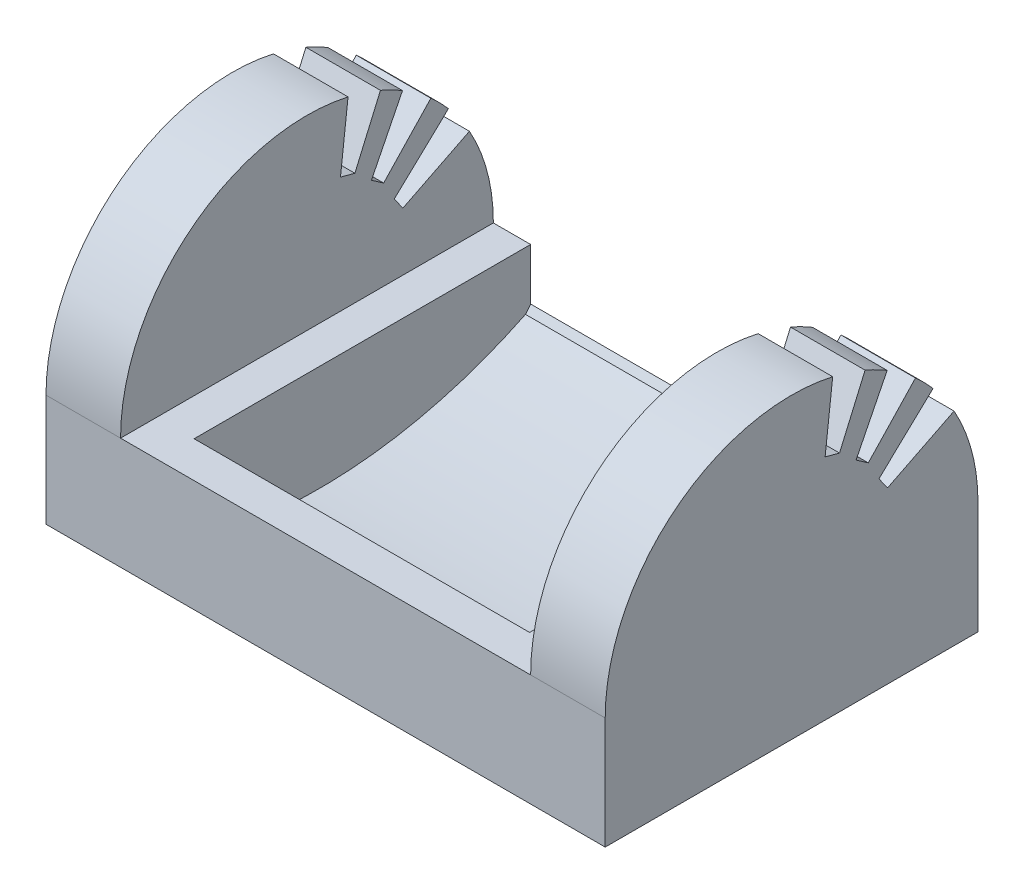
ISO-10303-21;
HEADER;
FILE_DESCRIPTION(('STEP AP214'),'2;1');
FILE_NAME('part.step','',(''),(''),'','','');
FILE_SCHEMA(('AUTOMOTIVE_DESIGN { 1 0 10303 214 1 1 1 1 }'));
ENDSEC;
DATA;
#1=APPLICATION_CONTEXT('core data for automotive mechanical design processes');
#2=APPLICATION_PROTOCOL_DEFINITION('international standard','automotive_design',2000,#1);
#3=PRODUCT_CONTEXT('',#1,'mechanical');
#4=PRODUCT('Part','Part','',(#3));
#5=PRODUCT_RELATED_PRODUCT_CATEGORY('part','',(#4));
#6=PRODUCT_DEFINITION_FORMATION('','',#4);
#7=PRODUCT_DEFINITION_CONTEXT('part definition',#1,'design');
#8=PRODUCT_DEFINITION('design','',#6,#7);
#9=PRODUCT_DEFINITION_SHAPE('','',#8);
#10=(LENGTH_UNIT() NAMED_UNIT(*) SI_UNIT(.MILLI.,.METRE.));
#11=(NAMED_UNIT(*) PLANE_ANGLE_UNIT() SI_UNIT($,.RADIAN.));
#12=(NAMED_UNIT(*) SI_UNIT($,.STERADIAN.) SOLID_ANGLE_UNIT());
#13=UNCERTAINTY_MEASURE_WITH_UNIT(LENGTH_MEASURE(1.E-05),#10,'distance_accuracy_value','');
#14=(GEOMETRIC_REPRESENTATION_CONTEXT(3) GLOBAL_UNCERTAINTY_ASSIGNED_CONTEXT((#13)) GLOBAL_UNIT_ASSIGNED_CONTEXT((#10,
#11,#12)) REPRESENTATION_CONTEXT('',''));
#15=CARTESIAN_POINT('',(0.,0.,0.));
#16=DIRECTION('',(0.,0.,1.));
#17=DIRECTION('',(1.,0.,0.));
#18=AXIS2_PLACEMENT_3D('',#15,#16,#17);
#19=CARTESIAN_POINT('',(0.,30.,0.));
#20=DIRECTION('',(0.,-1.,0.));
#21=DIRECTION('',(0.,0.,-1.));
#22=AXIS2_PLACEMENT_3D('',#19,#20,#21);
#23=PLANE('',#22);
#24=DIRECTION('',(0.,0.,1.));
#25=VECTOR('',#24,1.);
#26=CARTESIAN_POINT('',(30.,30.0000000000003,-111.193302220869));
#27=LINE('',#26,#25);
#28=CARTESIAN_POINT('',(30.,30.0000000000003,-100.));
#29=VERTEX_POINT('',#28);
#30=CARTESIAN_POINT('',(30.,30.0000000000003,-9.73338768577279));
#31=VERTEX_POINT('',#30);
#32=EDGE_CURVE('E259',#29,#31,#27,.T.);
#33=ORIENTED_EDGE('',*,*,#32,.F.);
#34=DIRECTION('',(-1.,0.,0.));
#35=VECTOR('',#34,1.);
#36=CARTESIAN_POINT('',(0.,30.,-100.));
#37=LINE('',#36,#35);
#38=CARTESIAN_POINT('',(20.,30.,-100.));
#39=VERTEX_POINT('',#38);
#40=EDGE_CURVE('E461',#29,#39,#37,.T.);
#41=ORIENTED_EDGE('',*,*,#40,.T.);
#42=DIRECTION('',(0.,0.,1.));
#43=VECTOR('',#42,1.);
#44=CARTESIAN_POINT('',(20.,29.9999999999996,0.));
#45=LINE('',#44,#43);
#46=CARTESIAN_POINT('',(20.,30.,0.));
#47=VERTEX_POINT('',#46);
#48=EDGE_CURVE('E425',#39,#47,#45,.T.);
#49=ORIENTED_EDGE('',*,*,#48,.T.);
#50=DIRECTION('',(1.,0.,0.));
#51=VECTOR('',#50,1.);
#52=CARTESIAN_POINT('',(0.,30.,0.));
#53=LINE('',#52,#51);
#54=CARTESIAN_POINT('',(130.,29.9999999999996,0.));
#55=VERTEX_POINT('',#54);
#56=EDGE_CURVE('E462',#47,#55,#53,.T.);
#57=ORIENTED_EDGE('',*,*,#56,.T.);
#58=DIRECTION('',(0.,0.,-1.));
#59=VECTOR('',#58,1.);
#60=CARTESIAN_POINT('',(130.,29.9999999999996,0.));
#61=LINE('',#60,#59);
#62=CARTESIAN_POINT('',(130.,30.,-100.));
#63=VERTEX_POINT('',#62);
#64=EDGE_CURVE('E442',#55,#63,#61,.T.);
#65=ORIENTED_EDGE('',*,*,#64,.T.);
#66=CARTESIAN_POINT('',(120.,30.,-100.));
#67=VERTEX_POINT('',#66);
#68=EDGE_CURVE('E467',#63,#67,#37,.T.);
#69=ORIENTED_EDGE('',*,*,#68,.T.);
#70=DIRECTION('',(0.,0.,1.));
#71=VECTOR('',#70,1.);
#72=CARTESIAN_POINT('',(120.,30.,-111.193302220869));
#73=LINE('',#72,#71);
#74=CARTESIAN_POINT('',(120.,30.,-9.73338768577281));
#75=VERTEX_POINT('',#74);
#76=EDGE_CURVE('E47',#67,#75,#73,.T.);
#77=ORIENTED_EDGE('',*,*,#76,.T.);
#78=DIRECTION('',(1.,0.,0.));
#79=VECTOR('',#78,1.);
#80=CARTESIAN_POINT('',(30.,30.0000000000003,-9.73338768577279));
#81=LINE('',#80,#79);
#82=EDGE_CURVE('E275',#31,#75,#81,.T.);
#83=ORIENTED_EDGE('',*,*,#82,.F.);
#84=EDGE_LOOP('',(#33,#41,#49,#57,#65,#69,#77,#83));
#85=FACE_BOUND('',#84,.T.);
#86=ADVANCED_FACE('F32',(#85),#23,.F.);
#87=CARTESIAN_POINT('',(0.,30.,-100.));
#88=DIRECTION('',(0.,0.,1.));
#89=DIRECTION('',(1.,0.,0.));
#90=AXIS2_PLACEMENT_3D('',#87,#88,#89);
#91=PLANE('',#90);
#92=DIRECTION('',(0.,1.,0.));
#93=VECTOR('',#92,1.);
#94=CARTESIAN_POINT('',(30.,30.,-100.));
#95=LINE('',#94,#93);
#96=CARTESIAN_POINT('',(30.,16.1624074250111,-100.));
#97=VERTEX_POINT('',#96);
#98=EDGE_CURVE('E11',#97,#29,#95,.T.);
#99=ORIENTED_EDGE('',*,*,#98,.F.);
#100=DIRECTION('',(1.,0.,0.));
#101=VECTOR('',#100,1.);
#102=CARTESIAN_POINT('',(0.,16.1624074250113,-100.));
#103=LINE('',#102,#101);
#104=CARTESIAN_POINT('',(120.,16.1624074250108,-100.));
#105=VERTEX_POINT('',#104);
#106=EDGE_CURVE('E40',#97,#105,#103,.T.);
#107=ORIENTED_EDGE('',*,*,#106,.T.);
#108=DIRECTION('',(0.,1.,0.));
#109=VECTOR('',#108,1.);
#110=CARTESIAN_POINT('',(120.,30.,-100.));
#111=LINE('',#110,#109);
#112=EDGE_CURVE('E514',#105,#67,#111,.T.);
#113=ORIENTED_EDGE('',*,*,#112,.T.);
#114=ORIENTED_EDGE('',*,*,#68,.F.);
#115=CARTESIAN_POINT('',(150.,30.,-100.));
#116=VERTEX_POINT('',#115);
#117=EDGE_CURVE('E463',#116,#63,#37,.T.);
#118=ORIENTED_EDGE('',*,*,#117,.F.);
#119=DIRECTION('',(0.,-1.,0.));
#120=VECTOR('',#119,1.);
#121=CARTESIAN_POINT('',(150.,30.,-100.));
#122=LINE('',#121,#120);
#123=CARTESIAN_POINT('',(150.,0.,-100.));
#124=VERTEX_POINT('',#123);
#125=EDGE_CURVE('E478',#116,#124,#122,.T.);
#126=ORIENTED_EDGE('',*,*,#125,.T.);
#127=DIRECTION('',(-1.,0.,0.));
#128=VECTOR('',#127,1.);
#129=CARTESIAN_POINT('',(0.,0.,-100.));
#130=LINE('',#129,#128);
#131=CARTESIAN_POINT('',(0.,0.,-100.));
#132=VERTEX_POINT('',#131);
#133=EDGE_CURVE('E474',#124,#132,#130,.T.);
#134=ORIENTED_EDGE('',*,*,#133,.T.);
#135=DIRECTION('',(0.,-1.,0.));
#136=VECTOR('',#135,1.);
#137=CARTESIAN_POINT('',(0.,30.,-100.));
#138=LINE('',#137,#136);
#139=CARTESIAN_POINT('',(0.,30.,-100.));
#140=VERTEX_POINT('',#139);
#141=EDGE_CURVE('E466',#140,#132,#138,.T.);
#142=ORIENTED_EDGE('',*,*,#141,.F.);
#143=DIRECTION('',(-1.,0.,0.));
#144=VECTOR('',#143,1.);
#145=CARTESIAN_POINT('',(0.,30.,-100.));
#146=LINE('',#145,#144);
#147=EDGE_CURVE('E422',#39,#140,#146,.T.);
#148=ORIENTED_EDGE('',*,*,#147,.F.);
#149=ORIENTED_EDGE('',*,*,#40,.F.);
#150=EDGE_LOOP('',(#99,#107,#113,#114,#118,#126,#134,#142,#148,#149));
#151=FACE_BOUND('',#150,.T.);
#152=ADVANCED_FACE('F517',(#151),#91,.F.);
#153=CARTESIAN_POINT('',(150.,30.,-50.));
#154=DIRECTION('',(-1.,0.,0.));
#155=DIRECTION('',(0.,0.,1.));
#156=AXIS2_PLACEMENT_3D('',#153,#154,#155);
#157=CYLINDRICAL_SURFACE('',#156,50.);
#158=CARTESIAN_POINT('',(130.,30.,-50.));
#159=DIRECTION('',(-1.,0.,0.));
#160=DIRECTION('',(0.,0.,1.));
#161=AXIS2_PLACEMENT_3D('',#158,#159,#160);
#162=CIRCLE('',#161,50.);
#163=CARTESIAN_POINT('',(130.,75.9503803838504,-69.711989817861));
#164=VERTEX_POINT('',#163);
#165=CARTESIAN_POINT('',(130.,72.9304289105035,-75.6315874178757));
#166=VERTEX_POINT('',#165);
#167=EDGE_CURVE('E450',#164,#166,#162,.T.);
#168=ORIENTED_EDGE('',*,*,#167,.F.);
#169=DIRECTION('',(-1.,0.,0.));
#170=VECTOR('',#169,1.);
#171=CARTESIAN_POINT('',(150.,75.9503803838504,-69.711989817861));
#172=LINE('',#171,#170);
#173=CARTESIAN_POINT('',(150.,75.9503803838504,-69.711989817861));
#174=VERTEX_POINT('',#173);
#175=EDGE_CURVE('E367',#164,#174,#172,.F.);
#176=ORIENTED_EDGE('',*,*,#175,.T.);
#177=CARTESIAN_POINT('',(150.,30.,-50.));
#178=DIRECTION('',(-1.,0.,0.));
#179=DIRECTION('',(0.,0.,1.));
#180=AXIS2_PLACEMENT_3D('',#177,#178,#179);
#181=CIRCLE('',#180,50.);
#182=CARTESIAN_POINT('',(150.,72.9304289105035,-75.6315874178757));
#183=VERTEX_POINT('',#182);
#184=EDGE_CURVE('E456',#174,#183,#181,.T.);
#185=ORIENTED_EDGE('',*,*,#184,.T.);
#186=DIRECTION('',(-1.,0.,0.));
#187=VECTOR('',#186,1.);
#188=CARTESIAN_POINT('',(150.,72.9304289105035,-75.6315874178757));
#189=LINE('',#188,#187);
#190=EDGE_CURVE('E340',#183,#166,#189,.T.);
#191=ORIENTED_EDGE('',*,*,#190,.T.);
#192=EDGE_LOOP('',(#168,#176,#185,#191));
#193=FACE_BOUND('',#192,.T.);
#194=ADVANCED_FACE('F550',(#193),#157,.T.);
#195=CARTESIAN_POINT('',(130.,67.358313012282,-83.2318589440368));
#196=VERTEX_POINT('',#195);
#197=CARTESIAN_POINT('',(130.,62.5716220085484,-87.9353323398153));
#198=VERTEX_POINT('',#197);
#199=EDGE_CURVE('E451',#196,#198,#162,.T.);
#200=ORIENTED_EDGE('',*,*,#199,.F.);
#201=DIRECTION('',(-1.,0.,0.));
#202=VECTOR('',#201,1.);
#203=CARTESIAN_POINT('',(150.,67.358313012282,-83.2318589440368));
#204=LINE('',#203,#202);
#205=CARTESIAN_POINT('',(150.,67.358313012282,-83.2318589440368));
#206=VERTEX_POINT('',#205);
#207=EDGE_CURVE('E349',#196,#206,#204,.F.);
#208=ORIENTED_EDGE('',*,*,#207,.T.);
#209=CARTESIAN_POINT('',(150.,62.5716220085485,-87.9353323398153));
#210=VERTEX_POINT('',#209);
#211=EDGE_CURVE('E457',#206,#210,#181,.T.);
#212=ORIENTED_EDGE('',*,*,#211,.T.);
#213=DIRECTION('',(-1.,0.,0.));
#214=VECTOR('',#213,1.);
#215=CARTESIAN_POINT('',(150.,62.5716220085485,-87.9353323398153));
#216=LINE('',#215,#214);
#217=EDGE_CURVE('E407',#210,#198,#216,.T.);
#218=ORIENTED_EDGE('',*,*,#217,.T.);
#219=EDGE_LOOP('',(#200,#208,#212,#218));
#220=FACE_BOUND('',#219,.T.);
#221=ADVANCED_FACE('F651',(#220),#157,.T.);
#222=CARTESIAN_POINT('',(150.,30.,-50.));
#223=DIRECTION('',(-1.,0.,0.));
#224=DIRECTION('',(0.,0.,1.));
#225=AXIS2_PLACEMENT_3D('',#222,#223,#224);
#226=CYLINDRICAL_SURFACE('',#225,50.);
#227=CARTESIAN_POINT('',(0.,30.,-50.));
#228=DIRECTION('',(-1.,0.,0.));
#229=DIRECTION('',(0.,0.,1.));
#230=AXIS2_PLACEMENT_3D('',#227,#228,#229);
#231=CIRCLE('',#230,50.);
#232=CARTESIAN_POINT('',(0.,75.9503803838504,-69.711989817861));
#233=VERTEX_POINT('',#232);
#234=CARTESIAN_POINT('',(0.,72.9304289105035,-75.6315874178757));
#235=VERTEX_POINT('',#234);
#236=EDGE_CURVE('E432',#233,#235,#231,.T.);
#237=ORIENTED_EDGE('',*,*,#236,.F.);
#238=DIRECTION('',(-1.,0.,0.));
#239=VECTOR('',#238,1.);
#240=CARTESIAN_POINT('',(150.,75.9503803838504,-69.711989817861));
#241=LINE('',#240,#239);
#242=CARTESIAN_POINT('',(20.,75.9503803838504,-69.711989817861));
#243=VERTEX_POINT('',#242);
#244=EDGE_CURVE('E505',#233,#243,#241,.F.);
#245=ORIENTED_EDGE('',*,*,#244,.T.);
#246=CARTESIAN_POINT('',(20.,30.,-50.));
#247=DIRECTION('',(-1.,0.,0.));
#248=DIRECTION('',(0.,0.,1.));
#249=AXIS2_PLACEMENT_3D('',#246,#247,#248);
#250=CIRCLE('',#249,50.);
#251=CARTESIAN_POINT('',(20.,72.9304289105035,-75.6315874178757));
#252=VERTEX_POINT('',#251);
#253=EDGE_CURVE('E438',#243,#252,#250,.T.);
#254=ORIENTED_EDGE('',*,*,#253,.T.);
#255=DIRECTION('',(-1.,0.,0.));
#256=VECTOR('',#255,1.);
#257=CARTESIAN_POINT('',(150.,72.9304289105035,-75.6315874178757));
#258=LINE('',#257,#256);
#259=EDGE_CURVE('E496',#252,#235,#258,.T.);
#260=ORIENTED_EDGE('',*,*,#259,.T.);
#261=EDGE_LOOP('',(#237,#245,#254,#260));
#262=FACE_BOUND('',#261,.T.);
#263=ADVANCED_FACE('F590',(#262),#226,.T.);
#264=CARTESIAN_POINT('',(0.,67.358313012282,-83.2318589440368));
#265=VERTEX_POINT('',#264);
#266=CARTESIAN_POINT('',(0.,62.5716220085484,-87.9353323398153));
#267=VERTEX_POINT('',#266);
#268=EDGE_CURVE('E433',#265,#267,#231,.T.);
#269=ORIENTED_EDGE('',*,*,#268,.F.);
#270=DIRECTION('',(-1.,0.,0.));
#271=VECTOR('',#270,1.);
#272=CARTESIAN_POINT('',(150.,67.358313012282,-83.2318589440368));
#273=LINE('',#272,#271);
#274=CARTESIAN_POINT('',(20.,67.358313012282,-83.2318589440368));
#275=VERTEX_POINT('',#274);
#276=EDGE_CURVE('E499',#265,#275,#273,.F.);
#277=ORIENTED_EDGE('',*,*,#276,.T.);
#278=CARTESIAN_POINT('',(20.,62.5716220085484,-87.9353323398153));
#279=VERTEX_POINT('',#278);
#280=EDGE_CURVE('E439',#275,#279,#250,.T.);
#281=ORIENTED_EDGE('',*,*,#280,.T.);
#282=DIRECTION('',(-1.,0.,0.));
#283=VECTOR('',#282,1.);
#284=CARTESIAN_POINT('',(150.,62.5716220085484,-87.9353323398153));
#285=LINE('',#284,#283);
#286=EDGE_CURVE('E487',#279,#267,#285,.T.);
#287=ORIENTED_EDGE('',*,*,#286,.T.);
#288=EDGE_LOOP('',(#269,#277,#281,#287));
#289=FACE_BOUND('',#288,.T.);
#290=ADVANCED_FACE('F607',(#289),#226,.T.);
#291=CARTESIAN_POINT('',(130.,54.5074010390718,-93.5819606524317));
#292=VERTEX_POINT('',#291);
#293=EDGE_CURVE('E445',#292,#63,#162,.T.);
#294=ORIENTED_EDGE('',*,*,#293,.F.);
#295=DIRECTION('',(-1.,0.,0.));
#296=VECTOR('',#295,1.);
#297=CARTESIAN_POINT('',(150.,54.5074010390718,-93.5819606524317));
#298=LINE('',#297,#296);
#299=CARTESIAN_POINT('',(150.,54.5074010390718,-93.5819606524317));
#300=VERTEX_POINT('',#299);
#301=EDGE_CURVE('E416',#292,#300,#298,.F.);
#302=ORIENTED_EDGE('',*,*,#301,.T.);
#303=EDGE_CURVE('E449',#300,#116,#181,.T.);
#304=ORIENTED_EDGE('',*,*,#303,.T.);
#305=ORIENTED_EDGE('',*,*,#117,.T.);
#306=EDGE_LOOP('',(#294,#302,#304,#305));
#307=FACE_BOUND('',#306,.T.);
#308=ADVANCED_FACE('F628',(#307),#157,.T.);
#309=CARTESIAN_POINT('',(0.,54.5074010390718,-93.5819606524317));
#310=VERTEX_POINT('',#309);
#311=EDGE_CURVE('E427',#310,#140,#231,.T.);
#312=ORIENTED_EDGE('',*,*,#311,.F.);
#313=DIRECTION('',(-1.,0.,0.));
#314=VECTOR('',#313,1.);
#315=CARTESIAN_POINT('',(150.,54.5074010390718,-93.5819606524317));
#316=LINE('',#315,#314);
#317=CARTESIAN_POINT('',(20.,54.5074010390718,-93.5819606524317));
#318=VERTEX_POINT('',#317);
#319=EDGE_CURVE('E490',#310,#318,#316,.F.);
#320=ORIENTED_EDGE('',*,*,#319,.T.);
#321=EDGE_CURVE('E431',#318,#39,#250,.T.);
#322=ORIENTED_EDGE('',*,*,#321,.T.);
#323=ORIENTED_EDGE('',*,*,#147,.T.);
#324=EDGE_LOOP('',(#312,#320,#322,#323));
#325=FACE_BOUND('',#324,.T.);
#326=ADVANCED_FACE('F569',(#325),#226,.T.);
#327=CARTESIAN_POINT('',(0.,30.,0.));
#328=DIRECTION('',(1.,0.,0.));
#329=DIRECTION('',(0.,0.,-1.));
#330=AXIS2_PLACEMENT_3D('',#327,#328,#329);
#331=PLANE('',#330);
#332=DIRECTION('',(0.,-0.258819045102521,-0.965925826289068));
#333=VECTOR('',#332,1.);
#334=CARTESIAN_POINT('',(0.,60.1149259575845,-62.8544646375299));
#335=LINE('',#334,#333);
#336=CARTESIAN_POINT('',(0.,61.1502021379946,-58.9907613323736));
#337=VERTEX_POINT('',#336);
#338=CARTESIAN_POINT('',(0.,60.1149259575845,-62.8544646375299));
#339=VERTEX_POINT('',#338);
#340=EDGE_CURVE('E293',#337,#339,#335,.T.);
#341=ORIENTED_EDGE('',*,*,#340,.T.);
#342=DIRECTION('',(0.,0.917650842515229,-0.397387633465224));
#343=VECTOR('',#342,1.);
#344=CARTESIAN_POINT('',(0.,60.1149259575845,-62.8544646375299));
#345=LINE('',#344,#343);
#346=EDGE_CURVE('E286',#339,#233,#345,.T.);
#347=ORIENTED_EDGE('',*,*,#346,.T.);
#348=ORIENTED_EDGE('',*,*,#236,.T.);
#349=DIRECTION('',(0.,-0.894271179967434,0.447525481598146));
#350=VECTOR('',#349,1.);
#351=CARTESIAN_POINT('',(0.,74.6043452600965,-76.4692754003217));
#352=LINE('',#351,#350);
#353=CARTESIAN_POINT('',(0.,56.2717860707641,-67.2950030275598));
#354=VERTEX_POINT('',#353);
#355=EDGE_CURVE('E313',#235,#354,#352,.T.);
#356=ORIENTED_EDGE('',*,*,#355,.T.);
#357=DIRECTION('',(0.,-0.573576436351047,-0.819152044288991));
#358=VECTOR('',#357,1.);
#359=CARTESIAN_POINT('',(0.,53.9774803253599,-70.5716112047157));
#360=LINE('',#359,#358);
#361=CARTESIAN_POINT('',(0.,53.9774803253599,-70.5716112047157));
#362=VERTEX_POINT('',#361);
#363=EDGE_CURVE('E317',#354,#362,#360,.T.);
#364=ORIENTED_EDGE('',*,*,#363,.T.);
#365=DIRECTION('',(0.,0.726395149815907,-0.687277299438826));
#366=VECTOR('',#365,1.);
#367=CARTESIAN_POINT('',(0.,53.9774803253599,-70.5716112047157));
#368=LINE('',#367,#366);
#369=EDGE_CURVE('E310',#362,#265,#368,.T.);
#370=ORIENTED_EDGE('',*,*,#369,.T.);
#371=ORIENTED_EDGE('',*,*,#268,.T.);
#372=DIRECTION('',(0.,-0.687277299438818,0.726395149815915));
#373=VECTOR('',#372,1.);
#374=CARTESIAN_POINT('',(0.,62.9365411949614,-88.3210216784587));
#375=LINE('',#374,#373);
#376=CARTESIAN_POINT('',(0.,48.8473565564656,-73.4299211072324));
#377=VERTEX_POINT('',#376);
#378=EDGE_CURVE('E380',#267,#377,#375,.T.);
#379=ORIENTED_EDGE('',*,*,#378,.T.);
#380=DIRECTION('',(0.,-0.819152044288993,-0.573576436351045));
#381=VECTOR('',#380,1.);
#382=CARTESIAN_POINT('',(0.,45.5707483793097,-75.7242268526366));
#383=LINE('',#382,#381);
#384=CARTESIAN_POINT('',(0.,45.5707483793097,-75.7242268526366));
#385=VERTEX_POINT('',#384);
#386=EDGE_CURVE('E384',#377,#385,#383,.T.);
#387=ORIENTED_EDGE('',*,*,#386,.T.);
#388=DIRECTION('',(0.,0.447525481598136,-0.894271179967439));
#389=VECTOR('',#388,1.);
#390=CARTESIAN_POINT('',(0.,45.5707483793097,-75.7242268526366));
#391=LINE('',#390,#389);
#392=EDGE_CURVE('E377',#385,#310,#391,.T.);
#393=ORIENTED_EDGE('',*,*,#392,.T.);
#394=ORIENTED_EDGE('',*,*,#311,.T.);
#395=ORIENTED_EDGE('',*,*,#141,.T.);
#396=DIRECTION('',(0.,0.,1.));
#397=VECTOR('',#396,1.);
#398=CARTESIAN_POINT('',(0.,0.,0.));
#399=LINE('',#398,#397);
#400=CARTESIAN_POINT('',(0.,0.,0.));
#401=VERTEX_POINT('',#400);
#402=EDGE_CURVE('E455',#132,#401,#399,.T.);
#403=ORIENTED_EDGE('',*,*,#402,.T.);
#404=DIRECTION('',(0.,-1.,0.));
#405=VECTOR('',#404,1.);
#406=CARTESIAN_POINT('',(0.,30.,0.));
#407=LINE('',#406,#405);
#408=CARTESIAN_POINT('',(0.,30.,0.));
#409=VERTEX_POINT('',#408);
#410=EDGE_CURVE('E484',#409,#401,#407,.T.);
#411=ORIENTED_EDGE('',*,*,#410,.F.);
#412=CARTESIAN_POINT('',(0.,78.7694144213034,-61.0247093840683));
#413=VERTEX_POINT('',#412);
#414=EDGE_CURVE('E428',#409,#413,#231,.T.);
#415=ORIENTED_EDGE('',*,*,#414,.T.);
#416=DIRECTION('',(0.,-0.993402758154992,0.11467763552696));
#417=VECTOR('',#416,1.);
#418=CARTESIAN_POINT('',(0.,81.5149586801719,-61.3416528606763));
#419=LINE('',#418,#417);
#420=EDGE_CURVE('E289',#413,#337,#419,.T.);
#421=ORIENTED_EDGE('',*,*,#420,.T.);
#422=EDGE_LOOP('',(#341,#347,#348,#356,#364,#370,#371,#379,#387,#393,#394,#395,#403,#411,#415,#421));
#423=FACE_BOUND('',#422,.T.);
#424=ADVANCED_FACE('F34',(#423),#331,.F.);
#425=CARTESIAN_POINT('',(0.,30.,0.));
#426=DIRECTION('',(0.,0.,-1.));
#427=DIRECTION('',(-1.,0.,0.));
#428=AXIS2_PLACEMENT_3D('',#425,#426,#427);
#429=PLANE('',#428);
#430=DIRECTION('',(1.,0.,0.));
#431=VECTOR('',#430,1.);
#432=CARTESIAN_POINT('',(0.,0.,0.));
#433=LINE('',#432,#431);
#434=CARTESIAN_POINT('',(150.,0.,0.));
#435=VERTEX_POINT('',#434);
#436=EDGE_CURVE('E470',#401,#435,#433,.T.);
#437=ORIENTED_EDGE('',*,*,#436,.T.);
#438=DIRECTION('',(0.,-1.,0.));
#439=VECTOR('',#438,1.);
#440=CARTESIAN_POINT('',(150.,30.,0.));
#441=LINE('',#440,#439);
#442=CARTESIAN_POINT('',(150.,30.,0.));
#443=VERTEX_POINT('',#442);
#444=EDGE_CURVE('E481',#443,#435,#441,.T.);
#445=ORIENTED_EDGE('',*,*,#444,.F.);
#446=DIRECTION('',(-1.,0.,0.));
#447=VECTOR('',#446,1.);
#448=CARTESIAN_POINT('',(150.,29.9999999999996,0.));
#449=LINE('',#448,#447);
#450=EDGE_CURVE('E437',#443,#55,#449,.T.);
#451=ORIENTED_EDGE('',*,*,#450,.T.);
#452=ORIENTED_EDGE('',*,*,#56,.F.);
#453=EDGE_CURVE('E458',#409,#47,#53,.T.);
#454=ORIENTED_EDGE('',*,*,#453,.F.);
#455=ORIENTED_EDGE('',*,*,#410,.T.);
#456=EDGE_LOOP('',(#437,#445,#451,#452,#454,#455));
#457=FACE_BOUND('',#456,.T.);
#458=ADVANCED_FACE('F562',(#457),#429,.F.);
#459=CARTESIAN_POINT('',(150.,30.,0.));
#460=DIRECTION('',(-1.,0.,0.));
#461=DIRECTION('',(0.,0.,1.));
#462=AXIS2_PLACEMENT_3D('',#459,#460,#461);
#463=PLANE('',#462);
#464=ORIENTED_EDGE('',*,*,#184,.F.);
#465=DIRECTION('',(0.,0.917650842515229,-0.397387633465224));
#466=VECTOR('',#465,1.);
#467=CARTESIAN_POINT('',(150.,60.1149259575845,-62.8544646375299));
#468=LINE('',#467,#466);
#469=CARTESIAN_POINT('',(150.,60.1149259575845,-62.8544646375299));
#470=VERTEX_POINT('',#469);
#471=EDGE_CURVE('E296',#470,#174,#468,.T.);
#472=ORIENTED_EDGE('',*,*,#471,.F.);
#473=DIRECTION('',(0.,-0.258819045102521,-0.965925826289068));
#474=VECTOR('',#473,1.);
#475=CARTESIAN_POINT('',(150.,60.1149259575845,-62.8544646375299));
#476=LINE('',#475,#474);
#477=CARTESIAN_POINT('',(150.,61.1502021379946,-58.9907613323736));
#478=VERTEX_POINT('',#477);
#479=EDGE_CURVE('E290',#478,#470,#476,.T.);
#480=ORIENTED_EDGE('',*,*,#479,.F.);
#481=DIRECTION('',(0.,-0.993402758154992,0.11467763552696));
#482=VECTOR('',#481,1.);
#483=CARTESIAN_POINT('',(150.,81.5149586801719,-61.3416528606763));
#484=LINE('',#483,#482);
#485=CARTESIAN_POINT('',(150.,78.7694144213034,-61.0247093840683));
#486=VERTEX_POINT('',#485);
#487=EDGE_CURVE('E298',#486,#478,#484,.T.);
#488=ORIENTED_EDGE('',*,*,#487,.F.);
#489=EDGE_CURVE('E452',#443,#486,#181,.T.);
#490=ORIENTED_EDGE('',*,*,#489,.F.);
#491=ORIENTED_EDGE('',*,*,#444,.T.);
#492=DIRECTION('',(0.,0.,-1.));
#493=VECTOR('',#492,1.);
#494=CARTESIAN_POINT('',(150.,0.,0.));
#495=LINE('',#494,#493);
#496=EDGE_CURVE('E472',#435,#124,#495,.T.);
#497=ORIENTED_EDGE('',*,*,#496,.T.);
#498=ORIENTED_EDGE('',*,*,#125,.F.);
#499=ORIENTED_EDGE('',*,*,#303,.F.);
#500=DIRECTION('',(0.,0.447525481598136,-0.894271179967439));
#501=VECTOR('',#500,1.);
#502=CARTESIAN_POINT('',(150.,45.5707483793097,-75.7242268526366));
#503=LINE('',#502,#501);
#504=CARTESIAN_POINT('',(150.,45.5707483793097,-75.7242268526366));
#505=VERTEX_POINT('',#504);
#506=EDGE_CURVE('E376',#505,#300,#503,.T.);
#507=ORIENTED_EDGE('',*,*,#506,.F.);
#508=DIRECTION('',(0.,-0.819152044288993,-0.573576436351045));
#509=VECTOR('',#508,1.);
#510=CARTESIAN_POINT('',(150.,45.5707483793097,-75.7242268526366));
#511=LINE('',#510,#509);
#512=CARTESIAN_POINT('',(150.,48.8473565564656,-73.4299211072324));
#513=VERTEX_POINT('',#512);
#514=EDGE_CURVE('E381',#513,#505,#511,.T.);
#515=ORIENTED_EDGE('',*,*,#514,.F.);
#516=DIRECTION('',(0.,-0.687277299438818,0.726395149815915));
#517=VECTOR('',#516,1.);
#518=CARTESIAN_POINT('',(150.,62.9365411949614,-88.3210216784587));
#519=LINE('',#518,#517);
#520=EDGE_CURVE('E389',#210,#513,#519,.T.);
#521=ORIENTED_EDGE('',*,*,#520,.F.);
#522=ORIENTED_EDGE('',*,*,#211,.F.);
#523=DIRECTION('',(0.,0.726395149815907,-0.687277299438826));
#524=VECTOR('',#523,1.);
#525=CARTESIAN_POINT('',(150.,53.9774803253599,-70.5716112047157));
#526=LINE('',#525,#524);
#527=CARTESIAN_POINT('',(150.,53.9774803253599,-70.5716112047157));
#528=VERTEX_POINT('',#527);
#529=EDGE_CURVE('E305',#528,#206,#526,.T.);
#530=ORIENTED_EDGE('',*,*,#529,.F.);
#531=DIRECTION('',(0.,-0.573576436351047,-0.819152044288991));
#532=VECTOR('',#531,1.);
#533=CARTESIAN_POINT('',(150.,53.9774803253599,-70.5716112047157));
#534=LINE('',#533,#532);
#535=CARTESIAN_POINT('',(150.,56.2717860707641,-67.2950030275598));
#536=VERTEX_POINT('',#535);
#537=EDGE_CURVE('E314',#536,#528,#534,.T.);
#538=ORIENTED_EDGE('',*,*,#537,.F.);
#539=DIRECTION('',(0.,-0.894271179967434,0.447525481598146));
#540=VECTOR('',#539,1.);
#541=CARTESIAN_POINT('',(150.,74.6043452600965,-76.4692754003217));
#542=LINE('',#541,#540);
#543=EDGE_CURVE('E322',#183,#536,#542,.T.);
#544=ORIENTED_EDGE('',*,*,#543,.F.);
#545=EDGE_LOOP('',(#464,#472,#480,#488,#490,#491,#497,#498,#499,#507,#515,#521,#522,#530,#538,#544));
#546=FACE_BOUND('',#545,.T.);
#547=ADVANCED_FACE('F558',(#546),#463,.F.);
#548=CARTESIAN_POINT('',(0.,0.,0.));
#549=DIRECTION('',(0.,-1.,0.));
#550=DIRECTION('',(0.,0.,-1.));
#551=AXIS2_PLACEMENT_3D('',#548,#549,#550);
#552=PLANE('',#551);
#553=ORIENTED_EDGE('',*,*,#402,.F.);
#554=ORIENTED_EDGE('',*,*,#133,.F.);
#555=ORIENTED_EDGE('',*,*,#496,.F.);
#556=ORIENTED_EDGE('',*,*,#436,.F.);
#557=EDGE_LOOP('',(#553,#554,#555,#556));
#558=FACE_BOUND('',#557,.T.);
#559=ADVANCED_FACE('F556',(#558),#552,.T.);
#560=ORIENTED_EDGE('',*,*,#489,.T.);
#561=DIRECTION('',(-1.,0.,0.));
#562=VECTOR('',#561,1.);
#563=CARTESIAN_POINT('',(150.,78.7694144213034,-61.0247093840683));
#564=LINE('',#563,#562);
#565=CARTESIAN_POINT('',(130.,78.7694144213034,-61.0247093840683));
#566=VERTEX_POINT('',#565);
#567=EDGE_CURVE('E358',#486,#566,#564,.T.);
#568=ORIENTED_EDGE('',*,*,#567,.T.);
#569=EDGE_CURVE('E446',#55,#566,#162,.T.);
#570=ORIENTED_EDGE('',*,*,#569,.F.);
#571=ORIENTED_EDGE('',*,*,#450,.F.);
#572=EDGE_LOOP('',(#560,#568,#570,#571));
#573=FACE_BOUND('',#572,.T.);
#574=ADVANCED_FACE('F554',(#573),#157,.T.);
#575=CARTESIAN_POINT('',(130.,29.9999999999996,0.));
#576=DIRECTION('',(1.,0.,0.));
#577=DIRECTION('',(0.,0.,-1.));
#578=AXIS2_PLACEMENT_3D('',#575,#576,#577);
#579=PLANE('',#578);
#580=DIRECTION('',(0.,-0.258819045102521,-0.965925826289068));
#581=VECTOR('',#580,1.);
#582=CARTESIAN_POINT('',(130.,73.8112245943525,-11.7391822494754));
#583=LINE('',#582,#581);
#584=CARTESIAN_POINT('',(130.,61.1502021379946,-58.9907613323736));
#585=VERTEX_POINT('',#584);
#586=CARTESIAN_POINT('',(130.,60.1149259575845,-62.8544646375299));
#587=VERTEX_POINT('',#586);
#588=EDGE_CURVE('E373',#585,#587,#583,.T.);
#589=ORIENTED_EDGE('',*,*,#588,.T.);
#590=DIRECTION('',(0.,0.917650842515229,-0.397387633465224));
#591=VECTOR('',#590,1.);
#592=CARTESIAN_POINT('',(130.,11.8349529781908,-41.9468783125843));
#593=LINE('',#592,#591);
#594=EDGE_CURVE('E364',#587,#164,#593,.T.);
#595=ORIENTED_EDGE('',*,*,#594,.T.);
#596=ORIENTED_EDGE('',*,*,#167,.T.);
#597=DIRECTION('',(0.,-0.894271179967435,0.447525481598146));
#598=VECTOR('',#597,1.);
#599=CARTESIAN_POINT('',(130.,8.32961321032312,-43.3030143793158));
#600=LINE('',#599,#598);
#601=CARTESIAN_POINT('',(130.,56.2717860707641,-67.2950030275598));
#602=VERTEX_POINT('',#601);
#603=EDGE_CURVE('E337',#166,#602,#600,.T.);
#604=ORIENTED_EDGE('',*,*,#603,.T.);
#605=DIRECTION('',(0.,-0.573576436351047,-0.819152044288991));
#606=VECTOR('',#605,1.);
#607=CARTESIAN_POINT('',(130.,79.2469419344356,-34.483079976268));
#608=LINE('',#607,#606);
#609=CARTESIAN_POINT('',(130.,53.9774803253599,-70.5716112047157));
#610=VERTEX_POINT('',#609);
#611=EDGE_CURVE('E370',#602,#610,#608,.T.);
#612=ORIENTED_EDGE('',*,*,#611,.T.);
#613=DIRECTION('',(0.,0.726395149815907,-0.687277299438826));
#614=VECTOR('',#613,1.);
#615=CARTESIAN_POINT('',(130.,6.09395385830017,-25.266709642214));
#616=LINE('',#615,#614);
#617=EDGE_CURVE('E346',#610,#196,#616,.T.);
#618=ORIENTED_EDGE('',*,*,#617,.T.);
#619=ORIENTED_EDGE('',*,*,#199,.T.);
#620=DIRECTION('',(0.,-0.687277299438818,0.726395149815915));
#621=VECTOR('',#620,1.);
#622=CARTESIAN_POINT('',(130.,3.28602696736248,-25.2753714666255));
#623=LINE('',#622,#621);
#624=CARTESIAN_POINT('',(130.,48.8473565564656,-73.4299211072324));
#625=VERTEX_POINT('',#624);
#626=EDGE_CURVE('E404',#198,#625,#623,.T.);
#627=ORIENTED_EDGE('',*,*,#626,.T.);
#628=DIRECTION('',(0.,-0.819152044288993,-0.573576436351045));
#629=VECTOR('',#628,1.);
#630=CARTESIAN_POINT('',(130.,70.7013679875352,-58.1275775630764));
#631=LINE('',#630,#629);
#632=CARTESIAN_POINT('',(130.,45.5707483793097,-75.7242268526366));
#633=VERTEX_POINT('',#632);
#634=EDGE_CURVE('E419',#625,#633,#631,.T.);
#635=ORIENTED_EDGE('',*,*,#634,.T.);
#636=DIRECTION('',(0.,0.447525481598136,-0.89427117996744));
#637=VECTOR('',#636,1.);
#638=CARTESIAN_POINT('',(130.,12.1467258388192,-8.93442089610534));
#639=LINE('',#638,#637);
#640=EDGE_CURVE('E413',#633,#292,#639,.T.);
#641=ORIENTED_EDGE('',*,*,#640,.T.);
#642=ORIENTED_EDGE('',*,*,#293,.T.);
#643=ORIENTED_EDGE('',*,*,#64,.F.);
#644=ORIENTED_EDGE('',*,*,#569,.T.);
#645=DIRECTION('',(0.,-0.993402758154992,0.11467763552696));
#646=VECTOR('',#645,1.);
#647=CARTESIAN_POINT('',(130.,23.6893638576627,-54.66631153235));
#648=LINE('',#647,#646);
#649=EDGE_CURVE('E355',#566,#585,#648,.T.);
#650=ORIENTED_EDGE('',*,*,#649,.T.);
#651=EDGE_LOOP('',(#589,#595,#596,#604,#612,#618,#619,#627,#635,#641,#642,#643,#644,#650));
#652=FACE_BOUND('',#651,.T.);
#653=ADVANCED_FACE('F625',(#652),#579,.F.);
#654=CARTESIAN_POINT('',(20.,29.9999999999996,0.));
#655=DIRECTION('',(-1.,0.,0.));
#656=DIRECTION('',(0.,0.,1.));
#657=AXIS2_PLACEMENT_3D('',#654,#655,#656);
#658=PLANE('',#657);
#659=ORIENTED_EDGE('',*,*,#253,.F.);
#660=DIRECTION('',(0.,-0.917650842515229,0.397387633465224));
#661=VECTOR('',#660,1.);
#662=CARTESIAN_POINT('',(20.,11.8349529781909,-41.9468783125843));
#663=LINE('',#662,#661);
#664=CARTESIAN_POINT('',(20.,60.1149259575845,-62.8544646375299));
#665=VERTEX_POINT('',#664);
#666=EDGE_CURVE('E361',#243,#665,#663,.T.);
#667=ORIENTED_EDGE('',*,*,#666,.T.);
#668=DIRECTION('',(0.,0.258819045102521,0.965925826289068));
#669=VECTOR('',#668,1.);
#670=CARTESIAN_POINT('',(20.,73.8112245943525,-11.7391822494754));
#671=LINE('',#670,#669);
#672=CARTESIAN_POINT('',(20.,61.1502021379946,-58.9907613323736));
#673=VERTEX_POINT('',#672);
#674=EDGE_CURVE('E511',#665,#673,#671,.T.);
#675=ORIENTED_EDGE('',*,*,#674,.T.);
#676=DIRECTION('',(0.,0.993402758154992,-0.11467763552696));
#677=VECTOR('',#676,1.);
#678=CARTESIAN_POINT('',(20.,23.6893638576627,-54.66631153235));
#679=LINE('',#678,#677);
#680=CARTESIAN_POINT('',(20.,78.7694144213034,-61.0247093840682));
#681=VERTEX_POINT('',#680);
#682=EDGE_CURVE('E352',#673,#681,#679,.T.);
#683=ORIENTED_EDGE('',*,*,#682,.T.);
#684=EDGE_CURVE('E434',#47,#681,#250,.T.);
#685=ORIENTED_EDGE('',*,*,#684,.F.);
#686=ORIENTED_EDGE('',*,*,#48,.F.);
#687=ORIENTED_EDGE('',*,*,#321,.F.);
#688=DIRECTION('',(0.,-0.447525481598136,0.89427117996744));
#689=VECTOR('',#688,1.);
#690=CARTESIAN_POINT('',(20.,12.1467258388192,-8.93442089610536));
#691=LINE('',#690,#689);
#692=CARTESIAN_POINT('',(20.,45.5707483793097,-75.7242268526366));
#693=VERTEX_POINT('',#692);
#694=EDGE_CURVE('E410',#318,#693,#691,.T.);
#695=ORIENTED_EDGE('',*,*,#694,.T.);
#696=DIRECTION('',(0.,0.819152044288993,0.573576436351045));
#697=VECTOR('',#696,1.);
#698=CARTESIAN_POINT('',(20.,70.7013679875352,-58.1275775630764));
#699=LINE('',#698,#697);
#700=CARTESIAN_POINT('',(20.,48.8473565564656,-73.4299211072324));
#701=VERTEX_POINT('',#700);
#702=EDGE_CURVE('E493',#693,#701,#699,.T.);
#703=ORIENTED_EDGE('',*,*,#702,.T.);
#704=DIRECTION('',(0.,0.687277299438818,-0.726395149815915));
#705=VECTOR('',#704,1.);
#706=CARTESIAN_POINT('',(20.,3.28602696736249,-25.2753714666255));
#707=LINE('',#706,#705);
#708=EDGE_CURVE('E397',#701,#279,#707,.T.);
#709=ORIENTED_EDGE('',*,*,#708,.T.);
#710=ORIENTED_EDGE('',*,*,#280,.F.);
#711=DIRECTION('',(0.,-0.726395149815907,0.687277299438826));
#712=VECTOR('',#711,1.);
#713=CARTESIAN_POINT('',(20.,6.09395385830018,-25.266709642214));
#714=LINE('',#713,#712);
#715=CARTESIAN_POINT('',(20.,53.9774803253599,-70.5716112047157));
#716=VERTEX_POINT('',#715);
#717=EDGE_CURVE('E343',#275,#716,#714,.T.);
#718=ORIENTED_EDGE('',*,*,#717,.T.);
#719=DIRECTION('',(0.,0.573576436351047,0.819152044288991));
#720=VECTOR('',#719,1.);
#721=CARTESIAN_POINT('',(20.,79.2469419344355,-34.483079976268));
#722=LINE('',#721,#720);
#723=CARTESIAN_POINT('',(20.,56.2717860707641,-67.2950030275598));
#724=VERTEX_POINT('',#723);
#725=EDGE_CURVE('E508',#716,#724,#722,.T.);
#726=ORIENTED_EDGE('',*,*,#725,.T.);
#727=DIRECTION('',(0.,0.894271179967435,-0.447525481598146));
#728=VECTOR('',#727,1.);
#729=CARTESIAN_POINT('',(20.,8.32961321032312,-43.3030143793158));
#730=LINE('',#729,#728);
#731=EDGE_CURVE('E330',#724,#252,#730,.T.);
#732=ORIENTED_EDGE('',*,*,#731,.T.);
#733=EDGE_LOOP('',(#659,#667,#675,#683,#685,#686,#687,#695,#703,#709,#710,#718,#726,#732));
#734=FACE_BOUND('',#733,.T.);
#735=ADVANCED_FACE('F596',(#734),#658,.F.);
#736=ORIENTED_EDGE('',*,*,#684,.T.);
#737=DIRECTION('',(-1.,0.,0.));
#738=VECTOR('',#737,1.);
#739=CARTESIAN_POINT('',(150.,78.7694144213034,-61.0247093840682));
#740=LINE('',#739,#738);
#741=EDGE_CURVE('E502',#681,#413,#740,.T.);
#742=ORIENTED_EDGE('',*,*,#741,.T.);
#743=ORIENTED_EDGE('',*,*,#414,.F.);
#744=ORIENTED_EDGE('',*,*,#453,.T.);
#745=EDGE_LOOP('',(#736,#742,#743,#744));
#746=FACE_BOUND('',#745,.T.);
#747=ADVANCED_FACE('F673',(#746),#226,.T.);
#748=CARTESIAN_POINT('',(0.,62.9365411949614,-88.3210216784587));
#749=DIRECTION('',(0.,0.726395149815915,0.687277299438818));
#750=DIRECTION('',(0.,-0.687277299438818,0.726395149815915));
#751=AXIS2_PLACEMENT_3D('',#748,#749,#750);
#752=PLANE('',#751);
#753=DIRECTION('',(1.,0.,0.));
#754=VECTOR('',#753,1.);
#755=CARTESIAN_POINT('',(0.,48.8473565564656,-73.4299211072324));
#756=LINE('',#755,#754);
#757=EDGE_CURVE('E399',#377,#701,#756,.T.);
#758=ORIENTED_EDGE('',*,*,#757,.F.);
#759=ORIENTED_EDGE('',*,*,#378,.F.);
#760=ORIENTED_EDGE('',*,*,#286,.F.);
#761=ORIENTED_EDGE('',*,*,#708,.F.);
#762=EDGE_LOOP('',(#758,#759,#760,#761));
#763=FACE_BOUND('',#762,.T.);
#764=ADVANCED_FACE('F610',(#763),#752,.F.);
#765=CARTESIAN_POINT('',(0.,45.5707483793097,-75.7242268526366));
#766=DIRECTION('',(0.,-0.894271179967439,-0.447525481598136));
#767=DIRECTION('',(0.,0.447525481598136,-0.89427117996744));
#768=AXIS2_PLACEMENT_3D('',#765,#766,#767);
#769=PLANE('',#768);
#770=ORIENTED_EDGE('',*,*,#319,.F.);
#771=ORIENTED_EDGE('',*,*,#392,.F.);
#772=DIRECTION('',(1.,0.,0.));
#773=VECTOR('',#772,1.);
#774=CARTESIAN_POINT('',(0.,45.5707483793097,-75.7242268526366));
#775=LINE('',#774,#773);
#776=EDGE_CURVE('E394',#385,#693,#775,.T.);
#777=ORIENTED_EDGE('',*,*,#776,.T.);
#778=ORIENTED_EDGE('',*,*,#694,.F.);
#779=EDGE_LOOP('',(#770,#771,#777,#778));
#780=FACE_BOUND('',#779,.T.);
#781=ADVANCED_FACE('F616',(#780),#769,.F.);
#782=CARTESIAN_POINT('',(0.,45.5707483793097,-75.7242268526366));
#783=DIRECTION('',(0.,-0.573576436351045,0.819152044288993));
#784=DIRECTION('',(0.,-0.819152044288993,-0.573576436351045));
#785=AXIS2_PLACEMENT_3D('',#782,#783,#784);
#786=PLANE('',#785);
#787=ORIENTED_EDGE('',*,*,#776,.F.);
#788=ORIENTED_EDGE('',*,*,#386,.F.);
#789=ORIENTED_EDGE('',*,*,#757,.T.);
#790=ORIENTED_EDGE('',*,*,#702,.F.);
#791=EDGE_LOOP('',(#787,#788,#789,#790));
#792=FACE_BOUND('',#791,.T.);
#793=ADVANCED_FACE('F613',(#792),#786,.F.);
#794=EDGE_CURVE('E387',#625,#513,#756,.T.);
#795=ORIENTED_EDGE('',*,*,#794,.T.);
#796=ORIENTED_EDGE('',*,*,#514,.T.);
#797=EDGE_CURVE('E398',#633,#505,#775,.T.);
#798=ORIENTED_EDGE('',*,*,#797,.F.);
#799=ORIENTED_EDGE('',*,*,#634,.F.);
#800=EDGE_LOOP('',(#795,#796,#798,#799));
#801=FACE_BOUND('',#800,.T.);
#802=ADVANCED_FACE('F656',(#801),#786,.F.);
#803=ORIENTED_EDGE('',*,*,#640,.F.);
#804=ORIENTED_EDGE('',*,*,#797,.T.);
#805=ORIENTED_EDGE('',*,*,#506,.T.);
#806=ORIENTED_EDGE('',*,*,#301,.F.);
#807=EDGE_LOOP('',(#803,#804,#805,#806));
#808=FACE_BOUND('',#807,.T.);
#809=ADVANCED_FACE('F658',(#808),#769,.F.);
#810=ORIENTED_EDGE('',*,*,#520,.T.);
#811=ORIENTED_EDGE('',*,*,#794,.F.);
#812=ORIENTED_EDGE('',*,*,#626,.F.);
#813=ORIENTED_EDGE('',*,*,#217,.F.);
#814=EDGE_LOOP('',(#810,#811,#812,#813));
#815=FACE_BOUND('',#814,.T.);
#816=ADVANCED_FACE('F648',(#815),#752,.F.);
#817=CARTESIAN_POINT('',(0.,74.6043452600965,-76.4692754003217));
#818=DIRECTION('',(0.,0.447525481598146,0.894271179967435));
#819=DIRECTION('',(0.,-0.894271179967435,0.447525481598146));
#820=AXIS2_PLACEMENT_3D('',#817,#818,#819);
#821=PLANE('',#820);
#822=DIRECTION('',(1.,0.,0.));
#823=VECTOR('',#822,1.);
#824=CARTESIAN_POINT('',(0.,56.2717860707641,-67.2950030275598));
#825=LINE('',#824,#823);
#826=EDGE_CURVE('E332',#354,#724,#825,.T.);
#827=ORIENTED_EDGE('',*,*,#826,.F.);
#828=ORIENTED_EDGE('',*,*,#355,.F.);
#829=ORIENTED_EDGE('',*,*,#259,.F.);
#830=ORIENTED_EDGE('',*,*,#731,.F.);
#831=EDGE_LOOP('',(#827,#828,#829,#830));
#832=FACE_BOUND('',#831,.T.);
#833=ADVANCED_FACE('F594',(#832),#821,.F.);
#834=CARTESIAN_POINT('',(0.,53.9774803253599,-70.5716112047157));
#835=DIRECTION('',(0.,-0.687277299438826,-0.726395149815907));
#836=DIRECTION('',(0.,0.726395149815907,-0.687277299438826));
#837=AXIS2_PLACEMENT_3D('',#834,#835,#836);
#838=PLANE('',#837);
#839=ORIENTED_EDGE('',*,*,#276,.F.);
#840=ORIENTED_EDGE('',*,*,#369,.F.);
#841=DIRECTION('',(1.,0.,0.));
#842=VECTOR('',#841,1.);
#843=CARTESIAN_POINT('',(0.,53.9774803253599,-70.5716112047157));
#844=LINE('',#843,#842);
#845=EDGE_CURVE('E327',#362,#716,#844,.T.);
#846=ORIENTED_EDGE('',*,*,#845,.T.);
#847=ORIENTED_EDGE('',*,*,#717,.F.);
#848=EDGE_LOOP('',(#839,#840,#846,#847));
#849=FACE_BOUND('',#848,.T.);
#850=ADVANCED_FACE('F603',(#849),#838,.F.);
#851=CARTESIAN_POINT('',(0.,53.9774803253599,-70.5716112047157));
#852=DIRECTION('',(0.,-0.819152044288991,0.573576436351047));
#853=DIRECTION('',(0.,-0.573576436351047,-0.819152044288991));
#854=AXIS2_PLACEMENT_3D('',#851,#852,#853);
#855=PLANE('',#854);
#856=ORIENTED_EDGE('',*,*,#845,.F.);
#857=ORIENTED_EDGE('',*,*,#363,.F.);
#858=ORIENTED_EDGE('',*,*,#826,.T.);
#859=ORIENTED_EDGE('',*,*,#725,.F.);
#860=EDGE_LOOP('',(#856,#857,#858,#859));
#861=FACE_BOUND('',#860,.T.);
#862=ADVANCED_FACE('F599',(#861),#855,.F.);
#863=CARTESIAN_POINT('',(0.,81.5149586801719,-61.3416528606763));
#864=DIRECTION('',(0.,0.11467763552696,0.993402758154992));
#865=DIRECTION('',(0.,-0.993402758154992,0.11467763552696));
#866=AXIS2_PLACEMENT_3D('',#863,#864,#865);
#867=PLANE('',#866);
#868=DIRECTION('',(1.,0.,0.));
#869=VECTOR('',#868,1.);
#870=CARTESIAN_POINT('',(0.,61.1502021379946,-58.9907613323736));
#871=LINE('',#870,#869);
#872=EDGE_CURVE('E307',#337,#673,#871,.T.);
#873=ORIENTED_EDGE('',*,*,#872,.F.);
#874=ORIENTED_EDGE('',*,*,#420,.F.);
#875=ORIENTED_EDGE('',*,*,#741,.F.);
#876=ORIENTED_EDGE('',*,*,#682,.F.);
#877=EDGE_LOOP('',(#873,#874,#875,#876));
#878=FACE_BOUND('',#877,.T.);
#879=ADVANCED_FACE('F699',(#878),#867,.F.);
#880=CARTESIAN_POINT('',(0.,60.1149259575845,-62.8544646375299));
#881=DIRECTION('',(0.,-0.397387633465224,-0.917650842515229));
#882=DIRECTION('',(0.,0.917650842515229,-0.397387633465224));
#883=AXIS2_PLACEMENT_3D('',#880,#881,#882);
#884=PLANE('',#883);
#885=ORIENTED_EDGE('',*,*,#244,.F.);
#886=ORIENTED_EDGE('',*,*,#346,.F.);
#887=DIRECTION('',(1.,0.,0.));
#888=VECTOR('',#887,1.);
#889=CARTESIAN_POINT('',(0.,60.1149259575845,-62.8544646375299));
#890=LINE('',#889,#888);
#891=EDGE_CURVE('E302',#339,#665,#890,.T.);
#892=ORIENTED_EDGE('',*,*,#891,.T.);
#893=ORIENTED_EDGE('',*,*,#666,.F.);
#894=EDGE_LOOP('',(#885,#886,#892,#893));
#895=FACE_BOUND('',#894,.T.);
#896=ADVANCED_FACE('F696',(#895),#884,.F.);
#897=CARTESIAN_POINT('',(0.,60.1149259575845,-62.8544646375299));
#898=DIRECTION('',(0.,-0.965925826289068,0.258819045102521));
#899=DIRECTION('',(0.,-0.258819045102521,-0.965925826289068));
#900=AXIS2_PLACEMENT_3D('',#897,#898,#899);
#901=PLANE('',#900);
#902=ORIENTED_EDGE('',*,*,#891,.F.);
#903=ORIENTED_EDGE('',*,*,#340,.F.);
#904=ORIENTED_EDGE('',*,*,#872,.T.);
#905=ORIENTED_EDGE('',*,*,#674,.F.);
#906=EDGE_LOOP('',(#902,#903,#904,#905));
#907=FACE_BOUND('',#906,.T.);
#908=ADVANCED_FACE('F689',(#907),#901,.F.);
#909=EDGE_CURVE('E320',#602,#536,#825,.T.);
#910=ORIENTED_EDGE('',*,*,#909,.T.);
#911=ORIENTED_EDGE('',*,*,#537,.T.);
#912=EDGE_CURVE('E331',#610,#528,#844,.T.);
#913=ORIENTED_EDGE('',*,*,#912,.F.);
#914=ORIENTED_EDGE('',*,*,#611,.F.);
#915=EDGE_LOOP('',(#910,#911,#913,#914));
#916=FACE_BOUND('',#915,.T.);
#917=ADVANCED_FACE('F682',(#916),#855,.F.);
#918=ORIENTED_EDGE('',*,*,#617,.F.);
#919=ORIENTED_EDGE('',*,*,#912,.T.);
#920=ORIENTED_EDGE('',*,*,#529,.T.);
#921=ORIENTED_EDGE('',*,*,#207,.F.);
#922=EDGE_LOOP('',(#918,#919,#920,#921));
#923=FACE_BOUND('',#922,.T.);
#924=ADVANCED_FACE('F679',(#923),#838,.F.);
#925=ORIENTED_EDGE('',*,*,#543,.T.);
#926=ORIENTED_EDGE('',*,*,#909,.F.);
#927=ORIENTED_EDGE('',*,*,#603,.F.);
#928=ORIENTED_EDGE('',*,*,#190,.F.);
#929=EDGE_LOOP('',(#925,#926,#927,#928));
#930=FACE_BOUND('',#929,.T.);
#931=ADVANCED_FACE('F641',(#930),#821,.F.);
#932=EDGE_CURVE('E55',#585,#478,#871,.T.);
#933=ORIENTED_EDGE('',*,*,#932,.T.);
#934=ORIENTED_EDGE('',*,*,#479,.T.);
#935=EDGE_CURVE('E306',#587,#470,#890,.T.);
#936=ORIENTED_EDGE('',*,*,#935,.F.);
#937=ORIENTED_EDGE('',*,*,#588,.F.);
#938=EDGE_LOOP('',(#933,#934,#936,#937));
#939=FACE_BOUND('',#938,.T.);
#940=ADVANCED_FACE('F686',(#939),#901,.F.);
#941=ORIENTED_EDGE('',*,*,#594,.F.);
#942=ORIENTED_EDGE('',*,*,#935,.T.);
#943=ORIENTED_EDGE('',*,*,#471,.T.);
#944=ORIENTED_EDGE('',*,*,#175,.F.);
#945=EDGE_LOOP('',(#941,#942,#943,#944));
#946=FACE_BOUND('',#945,.T.);
#947=ADVANCED_FACE('F691',(#946),#884,.F.);
#948=ORIENTED_EDGE('',*,*,#487,.T.);
#949=ORIENTED_EDGE('',*,*,#932,.F.);
#950=ORIENTED_EDGE('',*,*,#649,.F.);
#951=ORIENTED_EDGE('',*,*,#567,.F.);
#952=EDGE_LOOP('',(#948,#949,#950,#951));
#953=FACE_BOUND('',#952,.T.);
#954=ADVANCED_FACE('F694',(#953),#867,.F.);
#955=CARTESIAN_POINT('',(30.,30.0000000000003,-111.193302220869));
#956=DIRECTION('',(0.,-0.628907689653083,-0.777479979096067));
#957=DIRECTION('',(0.,0.777479979096067,-0.628907689653083));
#958=AXIS2_PLACEMENT_3D('',#955,#956,#957);
#959=PLANE('',#958);
#960=DIRECTION('',(0.,0.777479979096068,-0.628907689653083));
#961=VECTOR('',#960,1.);
#962=CARTESIAN_POINT('',(30.,30.0000000000003,-111.193302220869));
#963=LINE('',#962,#961);
#964=CARTESIAN_POINT('',(30.,14.4504004180789,-98.6151484278071));
#965=VERTEX_POINT('',#964);
#966=EDGE_CURVE('E270',#965,#97,#963,.T.);
#967=ORIENTED_EDGE('',*,*,#966,.F.);
#968=DIRECTION('',(1.,0.,0.));
#969=VECTOR('',#968,1.);
#970=CARTESIAN_POINT('',(30.,14.4504004180789,-98.6151484278071));
#971=LINE('',#970,#969);
#972=CARTESIAN_POINT('',(120.,14.4504004180786,-98.6151484278072));
#973=VERTEX_POINT('',#972);
#974=EDGE_CURVE('E281',#965,#973,#971,.T.);
#975=ORIENTED_EDGE('',*,*,#974,.T.);
#976=DIRECTION('',(0.,0.777479979096068,-0.628907689653083));
#977=VECTOR('',#976,1.);
#978=CARTESIAN_POINT('',(120.,30.,-111.193302220869));
#979=LINE('',#978,#977);
#980=EDGE_CURVE('E524',#973,#105,#979,.T.);
#981=ORIENTED_EDGE('',*,*,#980,.T.);
#982=ORIENTED_EDGE('',*,*,#106,.F.);
#983=EDGE_LOOP('',(#967,#975,#981,#982));
#984=FACE_BOUND('',#983,.T.);
#985=ADVANCED_FACE('F522',(#984),#959,.F.);
#986=CARTESIAN_POINT('',(30.,127.650261168422,-43.233881783959));
#987=DIRECTION('',(1.,0.,0.));
#988=DIRECTION('',(0.,0.,-1.));
#989=AXIS2_PLACEMENT_3D('',#986,#987,#988);
#990=PLANE('',#989);
#991=ORIENTED_EDGE('',*,*,#98,.T.);
#992=ORIENTED_EDGE('',*,*,#32,.T.);
#993=DIRECTION('',(0.,-1.,0.));
#994=VECTOR('',#993,1.);
#995=CARTESIAN_POINT('',(30.,30.0000000000003,-9.73338768577279));
#996=LINE('',#995,#994);
#997=CARTESIAN_POINT('',(30.,6.16359496940462,-9.73338768577279));
#998=VERTEX_POINT('',#997);
#999=EDGE_CURVE('E263',#31,#998,#996,.T.);
#1000=ORIENTED_EDGE('',*,*,#999,.T.);
#1001=CARTESIAN_POINT('',(30.,127.650261168422,-43.233881783959));
#1002=DIRECTION('',(1.,0.,0.));
#1003=DIRECTION('',(0.,0.,-1.));
#1004=AXIS2_PLACEMENT_3D('',#1001,#1002,#1003);
#1005=CIRCLE('',#1004,126.021002888304);
#1006=EDGE_CURVE('E277',#998,#965,#1005,.T.);
#1007=ORIENTED_EDGE('',*,*,#1006,.T.);
#1008=ORIENTED_EDGE('',*,*,#966,.T.);
#1009=EDGE_LOOP('',(#991,#992,#1000,#1007,#1008));
#1010=FACE_BOUND('',#1009,.T.);
#1011=ADVANCED_FACE('F261',(#1010),#990,.T.);
#1012=CARTESIAN_POINT('',(120.,127.650261168422,-43.233881783959));
#1013=DIRECTION('',(1.,0.,0.));
#1014=DIRECTION('',(0.,0.,-1.));
#1015=AXIS2_PLACEMENT_3D('',#1012,#1013,#1014);
#1016=PLANE('',#1015);
#1017=ORIENTED_EDGE('',*,*,#980,.F.);
#1018=CARTESIAN_POINT('',(120.,127.650261168422,-43.233881783959));
#1019=DIRECTION('',(1.,0.,0.));
#1020=DIRECTION('',(0.,0.,-1.));
#1021=AXIS2_PLACEMENT_3D('',#1018,#1019,#1020);
#1022=CIRCLE('',#1021,126.021002888304);
#1023=CARTESIAN_POINT('',(120.,6.16359496940433,-9.73338768577281));
#1024=VERTEX_POINT('',#1023);
#1025=EDGE_CURVE('E525',#1024,#973,#1022,.T.);
#1026=ORIENTED_EDGE('',*,*,#1025,.F.);
#1027=DIRECTION('',(0.,-1.,0.));
#1028=VECTOR('',#1027,1.);
#1029=CARTESIAN_POINT('',(120.,30.,-9.73338768577281));
#1030=LINE('',#1029,#1028);
#1031=EDGE_CURVE('E528',#75,#1024,#1030,.T.);
#1032=ORIENTED_EDGE('',*,*,#1031,.F.);
#1033=ORIENTED_EDGE('',*,*,#76,.F.);
#1034=ORIENTED_EDGE('',*,*,#112,.F.);
#1035=EDGE_LOOP('',(#1017,#1026,#1032,#1033,#1034));
#1036=FACE_BOUND('',#1035,.T.);
#1037=ADVANCED_FACE('F535',(#1036),#1016,.F.);
#1038=CARTESIAN_POINT('',(30.,127.650261168422,-43.233881783959));
#1039=DIRECTION('',(1.,0.,0.));
#1040=DIRECTION('',(0.,1.,0.));
#1041=AXIS2_PLACEMENT_3D('',#1038,#1039,#1040);
#1042=CYLINDRICAL_SURFACE('',#1041,126.021002888304);
#1043=ORIENTED_EDGE('',*,*,#1025,.T.);
#1044=ORIENTED_EDGE('',*,*,#974,.F.);
#1045=ORIENTED_EDGE('',*,*,#1006,.F.);
#1046=DIRECTION('',(1.,0.,0.));
#1047=VECTOR('',#1046,1.);
#1048=CARTESIAN_POINT('',(30.,6.16359496940462,-9.73338768577279));
#1049=LINE('',#1048,#1047);
#1050=EDGE_CURVE('E276',#998,#1024,#1049,.T.);
#1051=ORIENTED_EDGE('',*,*,#1050,.T.);
#1052=EDGE_LOOP('',(#1043,#1044,#1045,#1051));
#1053=FACE_BOUND('',#1052,.T.);
#1054=ADVANCED_FACE('F536',(#1053),#1042,.F.);
#1055=CARTESIAN_POINT('',(30.,30.0000000000003,-9.73338768577279));
#1056=DIRECTION('',(0.,0.,1.));
#1057=DIRECTION('',(1.,0.,0.));
#1058=AXIS2_PLACEMENT_3D('',#1055,#1056,#1057);
#1059=PLANE('',#1058);
#1060=ORIENTED_EDGE('',*,*,#1031,.T.);
#1061=ORIENTED_EDGE('',*,*,#1050,.F.);
#1062=ORIENTED_EDGE('',*,*,#999,.F.);
#1063=ORIENTED_EDGE('',*,*,#82,.T.);
#1064=EDGE_LOOP('',(#1060,#1061,#1062,#1063));
#1065=FACE_BOUND('',#1064,.T.);
#1066=ADVANCED_FACE('F274',(#1065),#1059,.F.);
#1067=CLOSED_SHELL('',(#86,#152,#194,#221,#263,#290,#308,#326,#424,#458,#547,#559,#574,#653,
#735,#747,#764,#781,#793,#802,#809,#816,#833,#850,#862,#879,#896,#908,#917,#924,#931,#940,#947,
#954,#985,#1011,#1037,#1054,#1066));
#1068=MANIFOLD_SOLID_BREP('B2',#1067);
#1069=ADVANCED_BREP_SHAPE_REPRESENTATION('',(#18,#1068),#14);
#1070=SHAPE_DEFINITION_REPRESENTATION(#9,#1069);
ENDSEC;
END-ISO-10303-21;
